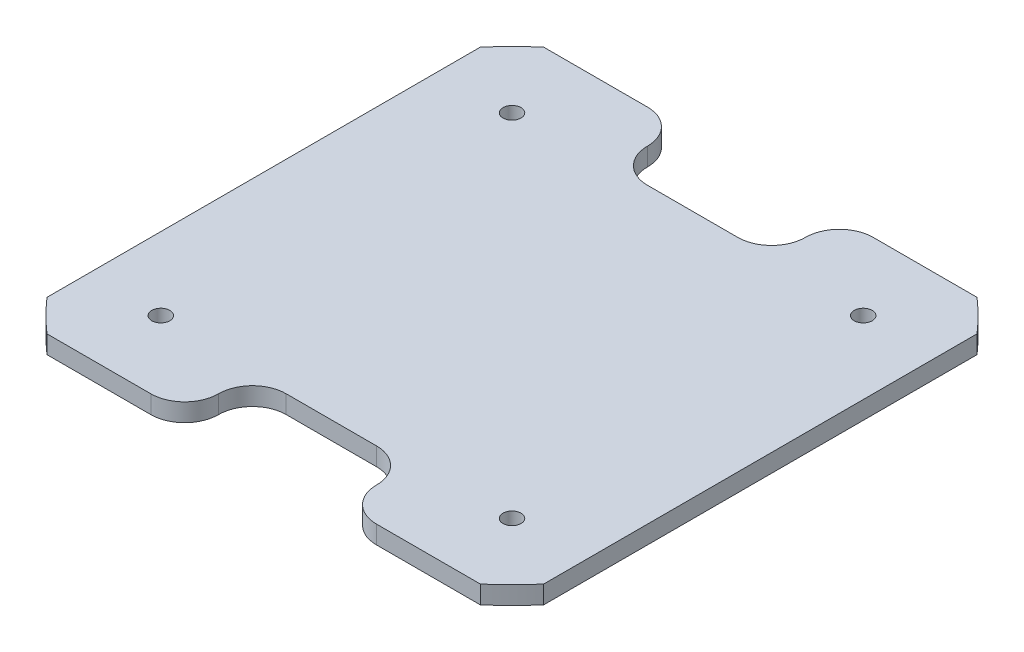
ISO-10303-21;
HEADER;
FILE_DESCRIPTION(('STEP AP214'),'2;1');
FILE_NAME('part.step','',(''),(''),'','','');
FILE_SCHEMA(('AUTOMOTIVE_DESIGN { 1 0 10303 214 1 1 1 1 }'));
ENDSEC;
DATA;
#1=APPLICATION_CONTEXT('core data for automotive mechanical design processes');
#2=APPLICATION_PROTOCOL_DEFINITION('international standard','automotive_design',2000,#1);
#3=PRODUCT_CONTEXT('',#1,'mechanical');
#4=PRODUCT('Part','Part','',(#3));
#5=PRODUCT_RELATED_PRODUCT_CATEGORY('part','',(#4));
#6=PRODUCT_DEFINITION_FORMATION('','',#4);
#7=PRODUCT_DEFINITION_CONTEXT('part definition',#1,'design');
#8=PRODUCT_DEFINITION('design','',#6,#7);
#9=PRODUCT_DEFINITION_SHAPE('','',#8);
#10=(LENGTH_UNIT() NAMED_UNIT(*) SI_UNIT(.MILLI.,.METRE.));
#11=(NAMED_UNIT(*) PLANE_ANGLE_UNIT() SI_UNIT($,.RADIAN.));
#12=(NAMED_UNIT(*) SI_UNIT($,.STERADIAN.) SOLID_ANGLE_UNIT());
#13=UNCERTAINTY_MEASURE_WITH_UNIT(LENGTH_MEASURE(1.E-05),#10,'distance_accuracy_value','');
#14=(GEOMETRIC_REPRESENTATION_CONTEXT(3) GLOBAL_UNCERTAINTY_ASSIGNED_CONTEXT((#13)) GLOBAL_UNIT_ASSIGNED_CONTEXT((#10,
#11,#12)) REPRESENTATION_CONTEXT('',''));
#15=CARTESIAN_POINT('',(0.,0.,0.));
#16=DIRECTION('',(0.,0.,1.));
#17=DIRECTION('',(1.,0.,0.));
#18=AXIS2_PLACEMENT_3D('',#15,#16,#17);
#19=CARTESIAN_POINT('',(0.,4.,0.));
#20=DIRECTION('',(0.,-1.,0.));
#21=DIRECTION('',(0.,0.,-1.));
#22=AXIS2_PLACEMENT_3D('',#19,#20,#21);
#23=CYLINDRICAL_SURFACE('',#22,73.);
#24=CARTESIAN_POINT('',(0.,0.,0.));
#25=DIRECTION('',(0.,1.,0.));
#26=DIRECTION('',(0.,0.,1.));
#27=AXIS2_PLACEMENT_3D('',#24,#25,#26);
#28=CIRCLE('',#27,73.);
#29=CARTESIAN_POINT('',(48.,0.,55.));
#30=VERTEX_POINT('',#29);
#31=CARTESIAN_POINT('',(55.,0.,48.));
#32=VERTEX_POINT('',#31);
#33=EDGE_CURVE('E206',#30,#32,#28,.T.);
#34=ORIENTED_EDGE('',*,*,#33,.T.);
#35=DIRECTION('',(0.,-1.,0.));
#36=VECTOR('',#35,1.);
#37=CARTESIAN_POINT('',(55.,4.,48.));
#38=LINE('',#37,#36);
#39=CARTESIAN_POINT('',(55.,4.,48.));
#40=VERTEX_POINT('',#39);
#41=EDGE_CURVE('E186',#40,#32,#38,.T.);
#42=ORIENTED_EDGE('',*,*,#41,.F.);
#43=CARTESIAN_POINT('',(0.,4.,0.));
#44=DIRECTION('',(0.,1.,0.));
#45=DIRECTION('',(0.,0.,1.));
#46=AXIS2_PLACEMENT_3D('',#43,#44,#45);
#47=CIRCLE('',#46,73.);
#48=CARTESIAN_POINT('',(48.,4.,55.));
#49=VERTEX_POINT('',#48);
#50=EDGE_CURVE('E193',#49,#40,#47,.T.);
#51=ORIENTED_EDGE('',*,*,#50,.F.);
#52=DIRECTION('',(0.,-1.,0.));
#53=VECTOR('',#52,1.);
#54=CARTESIAN_POINT('',(48.,4.,55.));
#55=LINE('',#54,#53);
#56=EDGE_CURVE('E334',#49,#30,#55,.T.);
#57=ORIENTED_EDGE('',*,*,#56,.T.);
#58=EDGE_LOOP('',(#34,#42,#51,#57));
#59=FACE_BOUND('',#58,.T.);
#60=ADVANCED_FACE('F44',(#59),#23,.T.);
#61=CARTESIAN_POINT('',(55.,4.,-48.));
#62=DIRECTION('',(-1.,0.,0.));
#63=DIRECTION('',(0.,0.,1.));
#64=AXIS2_PLACEMENT_3D('',#61,#62,#63);
#65=PLANE('',#64);
#66=DIRECTION('',(0.,0.,-1.));
#67=VECTOR('',#66,1.);
#68=CARTESIAN_POINT('',(55.,0.,-48.));
#69=LINE('',#68,#67);
#70=CARTESIAN_POINT('',(55.,0.,-48.));
#71=VERTEX_POINT('',#70);
#72=EDGE_CURVE('E375',#32,#71,#69,.T.);
#73=ORIENTED_EDGE('',*,*,#72,.T.);
#74=DIRECTION('',(0.,-1.,0.));
#75=VECTOR('',#74,1.);
#76=CARTESIAN_POINT('',(55.,4.,-48.));
#77=LINE('',#76,#75);
#78=CARTESIAN_POINT('',(55.,4.,-48.));
#79=VERTEX_POINT('',#78);
#80=EDGE_CURVE('E189',#79,#71,#77,.T.);
#81=ORIENTED_EDGE('',*,*,#80,.F.);
#82=DIRECTION('',(0.,0.,-1.));
#83=VECTOR('',#82,1.);
#84=CARTESIAN_POINT('',(55.,4.,-48.));
#85=LINE('',#84,#83);
#86=EDGE_CURVE('E182',#40,#79,#85,.T.);
#87=ORIENTED_EDGE('',*,*,#86,.F.);
#88=ORIENTED_EDGE('',*,*,#41,.T.);
#89=EDGE_LOOP('',(#73,#81,#87,#88));
#90=FACE_BOUND('',#89,.T.);
#91=ADVANCED_FACE('F184',(#90),#65,.F.);
#92=CARTESIAN_POINT('',(0.,4.,0.));
#93=DIRECTION('',(0.,-1.,0.));
#94=DIRECTION('',(0.,0.,-1.));
#95=AXIS2_PLACEMENT_3D('',#92,#93,#94);
#96=CYLINDRICAL_SURFACE('',#95,73.);
#97=CARTESIAN_POINT('',(0.,0.,0.));
#98=DIRECTION('',(0.,1.,0.));
#99=DIRECTION('',(0.,0.,1.));
#100=AXIS2_PLACEMENT_3D('',#97,#98,#99);
#101=CIRCLE('',#100,73.);
#102=CARTESIAN_POINT('',(48.,0.,-55.));
#103=VERTEX_POINT('',#102);
#104=EDGE_CURVE('E365',#71,#103,#101,.T.);
#105=ORIENTED_EDGE('',*,*,#104,.T.);
#106=DIRECTION('',(0.,-1.,0.));
#107=VECTOR('',#106,1.);
#108=CARTESIAN_POINT('',(48.,4.,-55.));
#109=LINE('',#108,#107);
#110=CARTESIAN_POINT('',(48.,4.,-55.));
#111=VERTEX_POINT('',#110);
#112=EDGE_CURVE('E216',#111,#103,#109,.T.);
#113=ORIENTED_EDGE('',*,*,#112,.F.);
#114=CARTESIAN_POINT('',(0.,4.,0.));
#115=DIRECTION('',(0.,1.,0.));
#116=DIRECTION('',(0.,0.,1.));
#117=AXIS2_PLACEMENT_3D('',#114,#115,#116);
#118=CIRCLE('',#117,73.);
#119=EDGE_CURVE('E192',#79,#111,#118,.T.);
#120=ORIENTED_EDGE('',*,*,#119,.F.);
#121=ORIENTED_EDGE('',*,*,#80,.T.);
#122=EDGE_LOOP('',(#105,#113,#120,#121));
#123=FACE_BOUND('',#122,.T.);
#124=ADVANCED_FACE('F420',(#123),#96,.T.);
#125=CARTESIAN_POINT('',(17.5,4.,-55.));
#126=DIRECTION('',(0.,0.,1.));
#127=DIRECTION('',(1.,0.,0.));
#128=AXIS2_PLACEMENT_3D('',#125,#126,#127);
#129=PLANE('',#128);
#130=DIRECTION('',(-1.,0.,0.));
#131=VECTOR('',#130,1.);
#132=CARTESIAN_POINT('',(17.5,0.,-55.));
#133=LINE('',#132,#131);
#134=CARTESIAN_POINT('',(25.,0.,-55.));
#135=VERTEX_POINT('',#134);
#136=EDGE_CURVE('E360',#103,#135,#133,.T.);
#137=ORIENTED_EDGE('',*,*,#136,.T.);
#138=DIRECTION('',(0.,-1.,0.));
#139=VECTOR('',#138,1.);
#140=CARTESIAN_POINT('',(25.,4.,-55.));
#141=LINE('',#140,#139);
#142=CARTESIAN_POINT('',(25.,4.,-55.));
#143=VERTEX_POINT('',#142);
#144=EDGE_CURVE('E228',#135,#143,#141,.F.);
#145=ORIENTED_EDGE('',*,*,#144,.T.);
#146=DIRECTION('',(-1.,0.,0.));
#147=VECTOR('',#146,1.);
#148=CARTESIAN_POINT('',(17.5,4.,-55.));
#149=LINE('',#148,#147);
#150=EDGE_CURVE('E362',#111,#143,#149,.T.);
#151=ORIENTED_EDGE('',*,*,#150,.F.);
#152=ORIENTED_EDGE('',*,*,#112,.T.);
#153=EDGE_LOOP('',(#137,#145,#151,#152));
#154=FACE_BOUND('',#153,.T.);
#155=ADVANCED_FACE('F359',(#154),#129,.F.);
#156=CARTESIAN_POINT('',(-17.5,4.,-40.));
#157=DIRECTION('',(0.,0.,1.));
#158=DIRECTION('',(1.,0.,0.));
#159=AXIS2_PLACEMENT_3D('',#156,#157,#158);
#160=PLANE('',#159);
#161=DIRECTION('',(-1.,0.,0.));
#162=VECTOR('',#161,1.);
#163=CARTESIAN_POINT('',(-17.5,4.,-40.));
#164=LINE('',#163,#162);
#165=CARTESIAN_POINT('',(10.,4.,-40.));
#166=VERTEX_POINT('',#165);
#167=CARTESIAN_POINT('',(-10.,4.,-40.));
#168=VERTEX_POINT('',#167);
#169=EDGE_CURVE('E423',#166,#168,#164,.T.);
#170=ORIENTED_EDGE('',*,*,#169,.F.);
#171=DIRECTION('',(0.,-1.,0.));
#172=VECTOR('',#171,1.);
#173=CARTESIAN_POINT('',(10.,0.,-40.));
#174=LINE('',#173,#172);
#175=CARTESIAN_POINT('',(10.,0.,-40.));
#176=VERTEX_POINT('',#175);
#177=EDGE_CURVE('E246',#166,#176,#174,.T.);
#178=ORIENTED_EDGE('',*,*,#177,.T.);
#179=DIRECTION('',(-1.,0.,0.));
#180=VECTOR('',#179,1.);
#181=CARTESIAN_POINT('',(-17.5,0.,-40.));
#182=LINE('',#181,#180);
#183=CARTESIAN_POINT('',(-10.,0.,-40.));
#184=VERTEX_POINT('',#183);
#185=EDGE_CURVE('E368',#176,#184,#182,.T.);
#186=ORIENTED_EDGE('',*,*,#185,.T.);
#187=DIRECTION('',(0.,-1.,0.));
#188=VECTOR('',#187,1.);
#189=CARTESIAN_POINT('',(-10.,4.,-40.));
#190=LINE('',#189,#188);
#191=EDGE_CURVE('E243',#184,#168,#190,.F.);
#192=ORIENTED_EDGE('',*,*,#191,.T.);
#193=EDGE_LOOP('',(#170,#178,#186,#192));
#194=FACE_BOUND('',#193,.T.);
#195=ADVANCED_FACE('F458',(#194),#160,.F.);
#196=CARTESIAN_POINT('',(-48.,4.,-55.));
#197=DIRECTION('',(0.,0.,1.));
#198=DIRECTION('',(1.,0.,0.));
#199=AXIS2_PLACEMENT_3D('',#196,#197,#198);
#200=PLANE('',#199);
#201=DIRECTION('',(-1.,0.,0.));
#202=VECTOR('',#201,1.);
#203=CARTESIAN_POINT('',(-48.,4.,-55.));
#204=LINE('',#203,#202);
#205=CARTESIAN_POINT('',(-25.,4.,-55.));
#206=VERTEX_POINT('',#205);
#207=CARTESIAN_POINT('',(-48.,4.,-55.));
#208=VERTEX_POINT('',#207);
#209=EDGE_CURVE('E429',#206,#208,#204,.T.);
#210=ORIENTED_EDGE('',*,*,#209,.F.);
#211=DIRECTION('',(0.,-1.,0.));
#212=VECTOR('',#211,1.);
#213=CARTESIAN_POINT('',(-25.,4.,-55.));
#214=LINE('',#213,#212);
#215=CARTESIAN_POINT('',(-25.,0.,-55.));
#216=VERTEX_POINT('',#215);
#217=EDGE_CURVE('E249',#206,#216,#214,.T.);
#218=ORIENTED_EDGE('',*,*,#217,.T.);
#219=DIRECTION('',(-1.,0.,0.));
#220=VECTOR('',#219,1.);
#221=CARTESIAN_POINT('',(-48.,0.,-55.));
#222=LINE('',#221,#220);
#223=CARTESIAN_POINT('',(-48.,0.,-55.));
#224=VERTEX_POINT('',#223);
#225=EDGE_CURVE('E372',#216,#224,#222,.T.);
#226=ORIENTED_EDGE('',*,*,#225,.T.);
#227=DIRECTION('',(0.,-1.,0.));
#228=VECTOR('',#227,1.);
#229=CARTESIAN_POINT('',(-48.,4.,-55.));
#230=LINE('',#229,#228);
#231=EDGE_CURVE('E348',#208,#224,#230,.T.);
#232=ORIENTED_EDGE('',*,*,#231,.F.);
#233=EDGE_LOOP('',(#210,#218,#226,#232));
#234=FACE_BOUND('',#233,.T.);
#235=ADVANCED_FACE('F445',(#234),#200,.F.);
#236=CARTESIAN_POINT('',(0.,4.,0.));
#237=DIRECTION('',(0.,-1.,0.));
#238=DIRECTION('',(0.,0.,-1.));
#239=AXIS2_PLACEMENT_3D('',#236,#237,#238);
#240=CYLINDRICAL_SURFACE('',#239,73.);
#241=CARTESIAN_POINT('',(0.,0.,0.));
#242=DIRECTION('',(0.,1.,0.));
#243=DIRECTION('',(0.,0.,1.));
#244=AXIS2_PLACEMENT_3D('',#241,#242,#243);
#245=CIRCLE('',#244,73.);
#246=CARTESIAN_POINT('',(-55.,0.,-48.));
#247=VERTEX_POINT('',#246);
#248=EDGE_CURVE('E381',#224,#247,#245,.T.);
#249=ORIENTED_EDGE('',*,*,#248,.T.);
#250=DIRECTION('',(0.,-1.,0.));
#251=VECTOR('',#250,1.);
#252=CARTESIAN_POINT('',(-55.,4.,-48.));
#253=LINE('',#252,#251);
#254=CARTESIAN_POINT('',(-55.,4.,-48.));
#255=VERTEX_POINT('',#254);
#256=EDGE_CURVE('E344',#255,#247,#253,.T.);
#257=ORIENTED_EDGE('',*,*,#256,.F.);
#258=CARTESIAN_POINT('',(0.,4.,0.));
#259=DIRECTION('',(0.,1.,0.));
#260=DIRECTION('',(0.,0.,1.));
#261=AXIS2_PLACEMENT_3D('',#258,#259,#260);
#262=CIRCLE('',#261,73.);
#263=EDGE_CURVE('E431',#208,#255,#262,.T.);
#264=ORIENTED_EDGE('',*,*,#263,.F.);
#265=ORIENTED_EDGE('',*,*,#231,.T.);
#266=EDGE_LOOP('',(#249,#257,#264,#265));
#267=FACE_BOUND('',#266,.T.);
#268=ADVANCED_FACE('F441',(#267),#240,.T.);
#269=CARTESIAN_POINT('',(-55.,4.,48.));
#270=DIRECTION('',(1.,0.,0.));
#271=DIRECTION('',(0.,0.,-1.));
#272=AXIS2_PLACEMENT_3D('',#269,#270,#271);
#273=PLANE('',#272);
#274=DIRECTION('',(0.,0.,1.));
#275=VECTOR('',#274,1.);
#276=CARTESIAN_POINT('',(-55.,0.,48.));
#277=LINE('',#276,#275);
#278=CARTESIAN_POINT('',(-55.,0.,48.));
#279=VERTEX_POINT('',#278);
#280=EDGE_CURVE('E384',#247,#279,#277,.T.);
#281=ORIENTED_EDGE('',*,*,#280,.T.);
#282=DIRECTION('',(0.,-1.,0.));
#283=VECTOR('',#282,1.);
#284=CARTESIAN_POINT('',(-55.,4.,48.));
#285=LINE('',#284,#283);
#286=CARTESIAN_POINT('',(-55.,4.,48.));
#287=VERTEX_POINT('',#286);
#288=EDGE_CURVE('E340',#287,#279,#285,.T.);
#289=ORIENTED_EDGE('',*,*,#288,.F.);
#290=DIRECTION('',(0.,0.,1.));
#291=VECTOR('',#290,1.);
#292=CARTESIAN_POINT('',(-55.,4.,48.));
#293=LINE('',#292,#291);
#294=EDGE_CURVE('E411',#255,#287,#293,.T.);
#295=ORIENTED_EDGE('',*,*,#294,.F.);
#296=ORIENTED_EDGE('',*,*,#256,.T.);
#297=EDGE_LOOP('',(#281,#289,#295,#296));
#298=FACE_BOUND('',#297,.T.);
#299=ADVANCED_FACE('F437',(#298),#273,.F.);
#300=CARTESIAN_POINT('',(0.,4.,0.));
#301=DIRECTION('',(0.,-1.,0.));
#302=DIRECTION('',(0.,0.,-1.));
#303=AXIS2_PLACEMENT_3D('',#300,#301,#302);
#304=CYLINDRICAL_SURFACE('',#303,73.);
#305=CARTESIAN_POINT('',(0.,0.,0.));
#306=DIRECTION('',(0.,1.,0.));
#307=DIRECTION('',(0.,0.,1.));
#308=AXIS2_PLACEMENT_3D('',#305,#306,#307);
#309=CIRCLE('',#308,73.);
#310=CARTESIAN_POINT('',(-48.,0.,55.));
#311=VERTEX_POINT('',#310);
#312=EDGE_CURVE('E330',#279,#311,#309,.T.);
#313=ORIENTED_EDGE('',*,*,#312,.T.);
#314=DIRECTION('',(0.,-1.,0.));
#315=VECTOR('',#314,1.);
#316=CARTESIAN_POINT('',(-48.,4.,55.));
#317=LINE('',#316,#315);
#318=CARTESIAN_POINT('',(-48.,4.,55.));
#319=VERTEX_POINT('',#318);
#320=EDGE_CURVE('E337',#319,#311,#317,.T.);
#321=ORIENTED_EDGE('',*,*,#320,.F.);
#322=CARTESIAN_POINT('',(0.,4.,0.));
#323=DIRECTION('',(0.,1.,0.));
#324=DIRECTION('',(0.,0.,1.));
#325=AXIS2_PLACEMENT_3D('',#322,#323,#324);
#326=CIRCLE('',#325,73.);
#327=EDGE_CURVE('E404',#287,#319,#326,.T.);
#328=ORIENTED_EDGE('',*,*,#327,.F.);
#329=ORIENTED_EDGE('',*,*,#288,.T.);
#330=EDGE_LOOP('',(#313,#321,#328,#329));
#331=FACE_BOUND('',#330,.T.);
#332=ADVANCED_FACE('F391',(#331),#304,.T.);
#333=CARTESIAN_POINT('',(-17.5,4.,55.));
#334=DIRECTION('',(0.,0.,-1.));
#335=DIRECTION('',(-1.,0.,0.));
#336=AXIS2_PLACEMENT_3D('',#333,#334,#335);
#337=PLANE('',#336);
#338=DIRECTION('',(1.,0.,0.));
#339=VECTOR('',#338,1.);
#340=CARTESIAN_POINT('',(-17.5,0.,55.));
#341=LINE('',#340,#339);
#342=CARTESIAN_POINT('',(-25.,0.,55.));
#343=VERTEX_POINT('',#342);
#344=EDGE_CURVE('E323',#311,#343,#341,.T.);
#345=ORIENTED_EDGE('',*,*,#344,.T.);
#346=DIRECTION('',(0.,-1.,0.));
#347=VECTOR('',#346,1.);
#348=CARTESIAN_POINT('',(-25.,4.,55.));
#349=LINE('',#348,#347);
#350=CARTESIAN_POINT('',(-25.,4.,55.));
#351=VERTEX_POINT('',#350);
#352=EDGE_CURVE('E253',#343,#351,#349,.F.);
#353=ORIENTED_EDGE('',*,*,#352,.T.);
#354=DIRECTION('',(1.,0.,0.));
#355=VECTOR('',#354,1.);
#356=CARTESIAN_POINT('',(-17.5,4.,55.));
#357=LINE('',#356,#355);
#358=EDGE_CURVE('E401',#319,#351,#357,.T.);
#359=ORIENTED_EDGE('',*,*,#358,.F.);
#360=ORIENTED_EDGE('',*,*,#320,.T.);
#361=EDGE_LOOP('',(#345,#353,#359,#360));
#362=FACE_BOUND('',#361,.T.);
#363=ADVANCED_FACE('F398',(#362),#337,.F.);
#364=CARTESIAN_POINT('',(-17.5,4.,40.));
#365=DIRECTION('',(0.,0.,-1.));
#366=DIRECTION('',(-1.,0.,0.));
#367=AXIS2_PLACEMENT_3D('',#364,#365,#366);
#368=PLANE('',#367);
#369=DIRECTION('',(1.,0.,0.));
#370=VECTOR('',#369,1.);
#371=CARTESIAN_POINT('',(-17.5,4.,40.));
#372=LINE('',#371,#370);
#373=CARTESIAN_POINT('',(-10.,4.,40.));
#374=VERTEX_POINT('',#373);
#375=CARTESIAN_POINT('',(10.,4.,40.));
#376=VERTEX_POINT('',#375);
#377=EDGE_CURVE('E406',#374,#376,#372,.T.);
#378=ORIENTED_EDGE('',*,*,#377,.F.);
#379=DIRECTION('',(0.,-1.,0.));
#380=VECTOR('',#379,1.);
#381=CARTESIAN_POINT('',(-10.,0.,40.));
#382=LINE('',#381,#380);
#383=CARTESIAN_POINT('',(-10.,0.,40.));
#384=VERTEX_POINT('',#383);
#385=EDGE_CURVE('E260',#374,#384,#382,.T.);
#386=ORIENTED_EDGE('',*,*,#385,.T.);
#387=DIRECTION('',(1.,0.,0.));
#388=VECTOR('',#387,1.);
#389=CARTESIAN_POINT('',(-17.5,0.,40.));
#390=LINE('',#389,#388);
#391=CARTESIAN_POINT('',(10.,0.,40.));
#392=VERTEX_POINT('',#391);
#393=EDGE_CURVE('E315',#384,#392,#390,.T.);
#394=ORIENTED_EDGE('',*,*,#393,.T.);
#395=DIRECTION('',(0.,-1.,0.));
#396=VECTOR('',#395,1.);
#397=CARTESIAN_POINT('',(10.,4.,40.));
#398=LINE('',#397,#396);
#399=EDGE_CURVE('E257',#392,#376,#398,.F.);
#400=ORIENTED_EDGE('',*,*,#399,.T.);
#401=EDGE_LOOP('',(#378,#386,#394,#400));
#402=FACE_BOUND('',#401,.T.);
#403=ADVANCED_FACE('F320',(#402),#368,.F.);
#404=CARTESIAN_POINT('',(48.,4.,55.));
#405=DIRECTION('',(0.,0.,-1.));
#406=DIRECTION('',(-1.,0.,0.));
#407=AXIS2_PLACEMENT_3D('',#404,#405,#406);
#408=PLANE('',#407);
#409=DIRECTION('',(1.,0.,0.));
#410=VECTOR('',#409,1.);
#411=CARTESIAN_POINT('',(48.,4.,55.));
#412=LINE('',#411,#410);
#413=CARTESIAN_POINT('',(25.,4.,55.));
#414=VERTEX_POINT('',#413);
#415=EDGE_CURVE('E198',#414,#49,#412,.T.);
#416=ORIENTED_EDGE('',*,*,#415,.F.);
#417=DIRECTION('',(0.,-1.,0.));
#418=VECTOR('',#417,1.);
#419=CARTESIAN_POINT('',(25.,4.,55.));
#420=LINE('',#419,#418);
#421=CARTESIAN_POINT('',(25.,0.,55.));
#422=VERTEX_POINT('',#421);
#423=EDGE_CURVE('E263',#414,#422,#420,.T.);
#424=ORIENTED_EDGE('',*,*,#423,.T.);
#425=DIRECTION('',(1.,0.,0.));
#426=VECTOR('',#425,1.);
#427=CARTESIAN_POINT('',(48.,0.,55.));
#428=LINE('',#427,#426);
#429=EDGE_CURVE('E203',#422,#30,#428,.T.);
#430=ORIENTED_EDGE('',*,*,#429,.T.);
#431=ORIENTED_EDGE('',*,*,#56,.F.);
#432=EDGE_LOOP('',(#416,#424,#430,#431));
#433=FACE_BOUND('',#432,.T.);
#434=ADVANCED_FACE('F501',(#433),#408,.F.);
#435=CARTESIAN_POINT('',(0.,4.,0.));
#436=DIRECTION('',(0.,1.,0.));
#437=DIRECTION('',(0.,0.,1.));
#438=AXIS2_PLACEMENT_3D('',#435,#436,#437);
#439=PLANE('',#438);
#440=CARTESIAN_POINT('',(38.8908729652599,4.,-38.8908729652603));
#441=DIRECTION('',(0.,1.,0.));
#442=DIRECTION('',(0.,0.,1.));
#443=AXIS2_PLACEMENT_3D('',#440,#441,#442);
#444=CIRCLE('',#443,1.99999999999999);
#445=CARTESIAN_POINT('',(38.8908729652599,4.,-36.8908729652603));
#446=VERTEX_POINT('',#445);
#447=EDGE_CURVE('E291',#446,#446,#444,.T.);
#448=ORIENTED_EDGE('',*,*,#447,.F.);
#449=EDGE_LOOP('',(#448));
#450=FACE_BOUND('',#449,.T.);
#451=CARTESIAN_POINT('',(38.8908729652603,4.,38.8908729652599));
#452=DIRECTION('',(0.,1.,0.));
#453=DIRECTION('',(0.,0.,1.));
#454=AXIS2_PLACEMENT_3D('',#451,#452,#453);
#455=CIRCLE('',#454,1.99999999999999);
#456=CARTESIAN_POINT('',(38.8908729652603,4.,40.8908729652599));
#457=VERTEX_POINT('',#456);
#458=EDGE_CURVE('E536',#457,#457,#455,.T.);
#459=ORIENTED_EDGE('',*,*,#458,.F.);
#460=EDGE_LOOP('',(#459));
#461=FACE_BOUND('',#460,.T.);
#462=CARTESIAN_POINT('',(-38.8908729652599,4.,38.8908729652603));
#463=DIRECTION('',(0.,1.,0.));
#464=DIRECTION('',(0.,0.,1.));
#465=AXIS2_PLACEMENT_3D('',#462,#463,#464);
#466=CIRCLE('',#465,1.99999999999999);
#467=CARTESIAN_POINT('',(-38.8908729652599,4.,40.8908729652603));
#468=VERTEX_POINT('',#467);
#469=EDGE_CURVE('E546',#468,#468,#466,.T.);
#470=ORIENTED_EDGE('',*,*,#469,.F.);
#471=EDGE_LOOP('',(#470));
#472=FACE_BOUND('',#471,.T.);
#473=CARTESIAN_POINT('',(-38.8908729652603,4.,-38.8908729652599));
#474=DIRECTION('',(0.,1.,0.));
#475=DIRECTION('',(0.,0.,1.));
#476=AXIS2_PLACEMENT_3D('',#473,#474,#475);
#477=CIRCLE('',#476,1.99999999999999);
#478=CARTESIAN_POINT('',(-38.8908729652603,4.,-36.8908729652599));
#479=VERTEX_POINT('',#478);
#480=EDGE_CURVE('E553',#479,#479,#477,.T.);
#481=ORIENTED_EDGE('',*,*,#480,.F.);
#482=EDGE_LOOP('',(#481));
#483=FACE_BOUND('',#482,.T.);
#484=ORIENTED_EDGE('',*,*,#150,.T.);
#485=CARTESIAN_POINT('',(25.,4.,-47.5));
#486=DIRECTION('',(0.,1.,0.));
#487=DIRECTION('',(0.,0.,1.));
#488=AXIS2_PLACEMENT_3D('',#485,#486,#487);
#489=CIRCLE('',#488,7.5);
#490=CARTESIAN_POINT('',(17.5,4.,-47.5));
#491=VERTEX_POINT('',#490);
#492=EDGE_CURVE('E240',#143,#491,#489,.T.);
#493=ORIENTED_EDGE('',*,*,#492,.T.);
#494=CARTESIAN_POINT('',(10.,4.,-47.5));
#495=DIRECTION('',(0.,1.,0.));
#496=DIRECTION('',(0.,0.,1.));
#497=AXIS2_PLACEMENT_3D('',#494,#495,#496);
#498=CIRCLE('',#497,7.5);
#499=EDGE_CURVE('E270',#491,#166,#498,.F.);
#500=ORIENTED_EDGE('',*,*,#499,.T.);
#501=ORIENTED_EDGE('',*,*,#169,.T.);
#502=CARTESIAN_POINT('',(-10.,4.,-47.5));
#503=DIRECTION('',(0.,1.,0.));
#504=DIRECTION('',(0.,0.,1.));
#505=AXIS2_PLACEMENT_3D('',#502,#503,#504);
#506=CIRCLE('',#505,7.5);
#507=CARTESIAN_POINT('',(-17.5,4.,-47.5));
#508=VERTEX_POINT('',#507);
#509=EDGE_CURVE('E276',#168,#508,#506,.F.);
#510=ORIENTED_EDGE('',*,*,#509,.T.);
#511=CARTESIAN_POINT('',(-25.,4.,-47.5));
#512=DIRECTION('',(0.,1.,0.));
#513=DIRECTION('',(0.,0.,1.));
#514=AXIS2_PLACEMENT_3D('',#511,#512,#513);
#515=CIRCLE('',#514,7.5);
#516=EDGE_CURVE('E237',#508,#206,#515,.T.);
#517=ORIENTED_EDGE('',*,*,#516,.T.);
#518=ORIENTED_EDGE('',*,*,#209,.T.);
#519=ORIENTED_EDGE('',*,*,#263,.T.);
#520=ORIENTED_EDGE('',*,*,#294,.T.);
#521=ORIENTED_EDGE('',*,*,#327,.T.);
#522=ORIENTED_EDGE('',*,*,#358,.T.);
#523=CARTESIAN_POINT('',(-25.,4.,47.5));
#524=DIRECTION('',(0.,1.,0.));
#525=DIRECTION('',(0.,0.,1.));
#526=AXIS2_PLACEMENT_3D('',#523,#524,#525);
#527=CIRCLE('',#526,7.5);
#528=CARTESIAN_POINT('',(-17.5,4.,47.5));
#529=VERTEX_POINT('',#528);
#530=EDGE_CURVE('E234',#351,#529,#527,.T.);
#531=ORIENTED_EDGE('',*,*,#530,.T.);
#532=CARTESIAN_POINT('',(-10.,4.,47.5));
#533=DIRECTION('',(0.,1.,0.));
#534=DIRECTION('',(0.,0.,1.));
#535=AXIS2_PLACEMENT_3D('',#532,#533,#534);
#536=CIRCLE('',#535,7.5);
#537=EDGE_CURVE('E282',#529,#374,#536,.F.);
#538=ORIENTED_EDGE('',*,*,#537,.T.);
#539=ORIENTED_EDGE('',*,*,#377,.T.);
#540=CARTESIAN_POINT('',(10.,4.,47.5));
#541=DIRECTION('',(0.,1.,0.));
#542=DIRECTION('',(0.,0.,1.));
#543=AXIS2_PLACEMENT_3D('',#540,#541,#542);
#544=CIRCLE('',#543,7.5);
#545=CARTESIAN_POINT('',(17.5,4.,47.5));
#546=VERTEX_POINT('',#545);
#547=EDGE_CURVE('E11',#376,#546,#544,.F.);
#548=ORIENTED_EDGE('',*,*,#547,.T.);
#549=CARTESIAN_POINT('',(25.,4.,47.5));
#550=DIRECTION('',(0.,1.,0.));
#551=DIRECTION('',(0.,0.,1.));
#552=AXIS2_PLACEMENT_3D('',#549,#550,#551);
#553=CIRCLE('',#552,7.5);
#554=EDGE_CURVE('E61',#546,#414,#553,.T.);
#555=ORIENTED_EDGE('',*,*,#554,.T.);
#556=ORIENTED_EDGE('',*,*,#415,.T.);
#557=ORIENTED_EDGE('',*,*,#50,.T.);
#558=ORIENTED_EDGE('',*,*,#86,.T.);
#559=ORIENTED_EDGE('',*,*,#119,.T.);
#560=EDGE_LOOP('',(#484,#493,#500,#501,#510,#517,#518,#519,#520,#521,#522,#531,#538,#539,#548,
#555,#556,#557,#558,#559));
#561=FACE_BOUND('',#560,.T.);
#562=ADVANCED_FACE('F197',(#450,#461,#472,#483,#561),#439,.T.);
#563=CARTESIAN_POINT('',(0.,0.,0.));
#564=DIRECTION('',(0.,1.,0.));
#565=DIRECTION('',(0.,0.,1.));
#566=AXIS2_PLACEMENT_3D('',#563,#564,#565);
#567=PLANE('',#566);
#568=CARTESIAN_POINT('',(38.8908729652599,0.,-38.8908729652603));
#569=DIRECTION('',(0.,1.,0.));
#570=DIRECTION('',(0.,0.,1.));
#571=AXIS2_PLACEMENT_3D('',#568,#569,#570);
#572=CIRCLE('',#571,2.);
#573=CARTESIAN_POINT('',(38.8908729652599,0.,-36.8908729652603));
#574=VERTEX_POINT('',#573);
#575=EDGE_CURVE('E530',#574,#574,#572,.T.);
#576=ORIENTED_EDGE('',*,*,#575,.T.);
#577=EDGE_LOOP('',(#576));
#578=FACE_BOUND('',#577,.T.);
#579=CARTESIAN_POINT('',(38.8908729652603,0.,38.8908729652599));
#580=DIRECTION('',(0.,1.,0.));
#581=DIRECTION('',(0.,0.,1.));
#582=AXIS2_PLACEMENT_3D('',#579,#580,#581);
#583=CIRCLE('',#582,2.);
#584=CARTESIAN_POINT('',(38.8908729652603,0.,40.8908729652599));
#585=VERTEX_POINT('',#584);
#586=EDGE_CURVE('E542',#585,#585,#583,.T.);
#587=ORIENTED_EDGE('',*,*,#586,.T.);
#588=EDGE_LOOP('',(#587));
#589=FACE_BOUND('',#588,.T.);
#590=CARTESIAN_POINT('',(-38.8908729652599,0.,38.8908729652603));
#591=DIRECTION('',(0.,1.,0.));
#592=DIRECTION('',(0.,0.,1.));
#593=AXIS2_PLACEMENT_3D('',#590,#591,#592);
#594=CIRCLE('',#593,2.);
#595=CARTESIAN_POINT('',(-38.8908729652599,0.,40.8908729652603));
#596=VERTEX_POINT('',#595);
#597=EDGE_CURVE('E549',#596,#596,#594,.T.);
#598=ORIENTED_EDGE('',*,*,#597,.T.);
#599=EDGE_LOOP('',(#598));
#600=FACE_BOUND('',#599,.T.);
#601=CARTESIAN_POINT('',(-38.8908729652603,0.,-38.8908729652599));
#602=DIRECTION('',(0.,1.,0.));
#603=DIRECTION('',(0.,0.,1.));
#604=AXIS2_PLACEMENT_3D('',#601,#602,#603);
#605=CIRCLE('',#604,2.);
#606=CARTESIAN_POINT('',(-38.8908729652603,0.,-36.8908729652599));
#607=VERTEX_POINT('',#606);
#608=EDGE_CURVE('E417',#607,#607,#605,.T.);
#609=ORIENTED_EDGE('',*,*,#608,.T.);
#610=EDGE_LOOP('',(#609));
#611=FACE_BOUND('',#610,.T.);
#612=ORIENTED_EDGE('',*,*,#185,.F.);
#613=CARTESIAN_POINT('',(10.,0.,-47.5));
#614=DIRECTION('',(0.,1.,0.));
#615=DIRECTION('',(0.,0.,1.));
#616=AXIS2_PLACEMENT_3D('',#613,#614,#615);
#617=CIRCLE('',#616,7.5);
#618=CARTESIAN_POINT('',(17.5,0.,-47.5));
#619=VERTEX_POINT('',#618);
#620=EDGE_CURVE('E267',#176,#619,#617,.T.);
#621=ORIENTED_EDGE('',*,*,#620,.T.);
#622=CARTESIAN_POINT('',(25.,0.,-47.5));
#623=DIRECTION('',(0.,1.,0.));
#624=DIRECTION('',(0.,0.,1.));
#625=AXIS2_PLACEMENT_3D('',#622,#623,#624);
#626=CIRCLE('',#625,7.5);
#627=EDGE_CURVE('E225',#619,#135,#626,.F.);
#628=ORIENTED_EDGE('',*,*,#627,.T.);
#629=ORIENTED_EDGE('',*,*,#136,.F.);
#630=ORIENTED_EDGE('',*,*,#104,.F.);
#631=ORIENTED_EDGE('',*,*,#72,.F.);
#632=ORIENTED_EDGE('',*,*,#33,.F.);
#633=ORIENTED_EDGE('',*,*,#429,.F.);
#634=CARTESIAN_POINT('',(25.,0.,47.5));
#635=DIRECTION('',(0.,1.,0.));
#636=DIRECTION('',(0.,0.,1.));
#637=AXIS2_PLACEMENT_3D('',#634,#635,#636);
#638=CIRCLE('',#637,7.5);
#639=CARTESIAN_POINT('',(17.5,0.,47.5));
#640=VERTEX_POINT('',#639);
#641=EDGE_CURVE('E208',#422,#640,#638,.F.);
#642=ORIENTED_EDGE('',*,*,#641,.T.);
#643=CARTESIAN_POINT('',(10.,0.,47.5));
#644=DIRECTION('',(0.,1.,0.));
#645=DIRECTION('',(0.,0.,1.));
#646=AXIS2_PLACEMENT_3D('',#643,#644,#645);
#647=CIRCLE('',#646,7.5);
#648=EDGE_CURVE('E54',#640,#392,#647,.T.);
#649=ORIENTED_EDGE('',*,*,#648,.T.);
#650=ORIENTED_EDGE('',*,*,#393,.F.);
#651=CARTESIAN_POINT('',(-10.,0.,47.5));
#652=DIRECTION('',(0.,1.,0.));
#653=DIRECTION('',(0.,0.,1.));
#654=AXIS2_PLACEMENT_3D('',#651,#652,#653);
#655=CIRCLE('',#654,7.5);
#656=CARTESIAN_POINT('',(-17.5,0.,47.5));
#657=VERTEX_POINT('',#656);
#658=EDGE_CURVE('E279',#384,#657,#655,.T.);
#659=ORIENTED_EDGE('',*,*,#658,.T.);
#660=CARTESIAN_POINT('',(-25.,0.,47.5));
#661=DIRECTION('',(0.,1.,0.));
#662=DIRECTION('',(0.,0.,1.));
#663=AXIS2_PLACEMENT_3D('',#660,#661,#662);
#664=CIRCLE('',#663,7.5);
#665=EDGE_CURVE('E213',#657,#343,#664,.F.);
#666=ORIENTED_EDGE('',*,*,#665,.T.);
#667=ORIENTED_EDGE('',*,*,#344,.F.);
#668=ORIENTED_EDGE('',*,*,#312,.F.);
#669=ORIENTED_EDGE('',*,*,#280,.F.);
#670=ORIENTED_EDGE('',*,*,#248,.F.);
#671=ORIENTED_EDGE('',*,*,#225,.F.);
#672=CARTESIAN_POINT('',(-25.,0.,-47.5));
#673=DIRECTION('',(0.,1.,0.));
#674=DIRECTION('',(0.,0.,1.));
#675=AXIS2_PLACEMENT_3D('',#672,#673,#674);
#676=CIRCLE('',#675,7.5);
#677=CARTESIAN_POINT('',(-17.5,0.,-47.5));
#678=VERTEX_POINT('',#677);
#679=EDGE_CURVE('E222',#216,#678,#676,.F.);
#680=ORIENTED_EDGE('',*,*,#679,.T.);
#681=CARTESIAN_POINT('',(-10.,0.,-47.5));
#682=DIRECTION('',(0.,1.,0.));
#683=DIRECTION('',(0.,0.,1.));
#684=AXIS2_PLACEMENT_3D('',#681,#682,#683);
#685=CIRCLE('',#684,7.5);
#686=EDGE_CURVE('E273',#678,#184,#685,.T.);
#687=ORIENTED_EDGE('',*,*,#686,.T.);
#688=EDGE_LOOP('',(#612,#621,#628,#629,#630,#631,#632,#633,#642,#649,#650,#659,#666,#667,#668,
#669,#670,#671,#680,#687));
#689=FACE_BOUND('',#688,.T.);
#690=ADVANCED_FACE('F314',(#578,#589,#600,#611,#689),#567,.F.);
#691=CARTESIAN_POINT('',(-38.8908729652603,4.,-38.8908729652599));
#692=DIRECTION('',(0.,1.,0.));
#693=DIRECTION('',(0.,0.,1.));
#694=AXIS2_PLACEMENT_3D('',#691,#692,#693);
#695=CYLINDRICAL_SURFACE('',#694,1.99999999999999);
#696=ORIENTED_EDGE('',*,*,#608,.F.);
#697=EDGE_LOOP('',(#696));
#698=FACE_BOUND('',#697,.T.);
#699=ORIENTED_EDGE('',*,*,#480,.T.);
#700=EDGE_LOOP('',(#699));
#701=FACE_BOUND('',#700,.T.);
#702=ADVANCED_FACE('F507',(#698,#701),#695,.F.);
#703=CARTESIAN_POINT('',(-38.8908729652599,4.,38.8908729652603));
#704=DIRECTION('',(0.,1.,0.));
#705=DIRECTION('',(0.,0.,1.));
#706=AXIS2_PLACEMENT_3D('',#703,#704,#705);
#707=CYLINDRICAL_SURFACE('',#706,1.99999999999999);
#708=ORIENTED_EDGE('',*,*,#597,.F.);
#709=EDGE_LOOP('',(#708));
#710=FACE_BOUND('',#709,.T.);
#711=ORIENTED_EDGE('',*,*,#469,.T.);
#712=EDGE_LOOP('',(#711));
#713=FACE_BOUND('',#712,.T.);
#714=ADVANCED_FACE('F514',(#710,#713),#707,.F.);
#715=CARTESIAN_POINT('',(38.8908729652603,4.,38.8908729652599));
#716=DIRECTION('',(0.,1.,0.));
#717=DIRECTION('',(0.,0.,1.));
#718=AXIS2_PLACEMENT_3D('',#715,#716,#717);
#719=CYLINDRICAL_SURFACE('',#718,1.99999999999999);
#720=ORIENTED_EDGE('',*,*,#586,.F.);
#721=EDGE_LOOP('',(#720));
#722=FACE_BOUND('',#721,.T.);
#723=ORIENTED_EDGE('',*,*,#458,.T.);
#724=EDGE_LOOP('',(#723));
#725=FACE_BOUND('',#724,.T.);
#726=ADVANCED_FACE('F518',(#722,#725),#719,.F.);
#727=CARTESIAN_POINT('',(38.8908729652599,4.,-38.8908729652603));
#728=DIRECTION('',(0.,1.,0.));
#729=DIRECTION('',(0.,0.,1.));
#730=AXIS2_PLACEMENT_3D('',#727,#728,#729);
#731=CYLINDRICAL_SURFACE('',#730,1.99999999999999);
#732=ORIENTED_EDGE('',*,*,#575,.F.);
#733=EDGE_LOOP('',(#732));
#734=FACE_BOUND('',#733,.T.);
#735=ORIENTED_EDGE('',*,*,#447,.T.);
#736=EDGE_LOOP('',(#735));
#737=FACE_BOUND('',#736,.T.);
#738=ADVANCED_FACE('F474',(#734,#737),#731,.F.);
#739=CARTESIAN_POINT('',(10.,4.,-47.5));
#740=DIRECTION('',(0.,1.,0.));
#741=DIRECTION('',(0.,0.,1.));
#742=AXIS2_PLACEMENT_3D('',#739,#740,#741);
#743=CYLINDRICAL_SURFACE('',#742,7.5);
#744=ORIENTED_EDGE('',*,*,#177,.F.);
#745=ORIENTED_EDGE('',*,*,#499,.F.);
#746=DIRECTION('',(0.,-1.,0.));
#747=VECTOR('',#746,1.);
#748=CARTESIAN_POINT('',(17.5,4.,-47.5));
#749=LINE('',#748,#747);
#750=EDGE_CURVE('E287',#619,#491,#749,.F.);
#751=ORIENTED_EDGE('',*,*,#750,.F.);
#752=ORIENTED_EDGE('',*,*,#620,.F.);
#753=EDGE_LOOP('',(#744,#745,#751,#752));
#754=FACE_BOUND('',#753,.T.);
#755=ADVANCED_FACE('F463',(#754),#743,.F.);
#756=CARTESIAN_POINT('',(25.,4.,-47.5));
#757=DIRECTION('',(0.,-1.,0.));
#758=DIRECTION('',(0.,0.,-1.));
#759=AXIS2_PLACEMENT_3D('',#756,#757,#758);
#760=CYLINDRICAL_SURFACE('',#759,7.5);
#761=ORIENTED_EDGE('',*,*,#492,.F.);
#762=ORIENTED_EDGE('',*,*,#144,.F.);
#763=ORIENTED_EDGE('',*,*,#627,.F.);
#764=ORIENTED_EDGE('',*,*,#750,.T.);
#765=EDGE_LOOP('',(#761,#762,#763,#764));
#766=FACE_BOUND('',#765,.T.);
#767=ADVANCED_FACE('F466',(#766),#760,.T.);
#768=CARTESIAN_POINT('',(-10.,4.,-47.5));
#769=DIRECTION('',(0.,1.,0.));
#770=DIRECTION('',(0.,0.,1.));
#771=AXIS2_PLACEMENT_3D('',#768,#769,#770);
#772=CYLINDRICAL_SURFACE('',#771,7.5);
#773=DIRECTION('',(0.,-1.,0.));
#774=VECTOR('',#773,1.);
#775=CARTESIAN_POINT('',(-17.5,0.,-47.5));
#776=LINE('',#775,#774);
#777=EDGE_CURVE('E292',#508,#678,#776,.T.);
#778=ORIENTED_EDGE('',*,*,#777,.F.);
#779=ORIENTED_EDGE('',*,*,#509,.F.);
#780=ORIENTED_EDGE('',*,*,#191,.F.);
#781=ORIENTED_EDGE('',*,*,#686,.F.);
#782=EDGE_LOOP('',(#778,#779,#780,#781));
#783=FACE_BOUND('',#782,.T.);
#784=ADVANCED_FACE('F454',(#783),#772,.F.);
#785=CARTESIAN_POINT('',(-25.,4.,-47.5));
#786=DIRECTION('',(0.,-1.,0.));
#787=DIRECTION('',(0.,0.,-1.));
#788=AXIS2_PLACEMENT_3D('',#785,#786,#787);
#789=CYLINDRICAL_SURFACE('',#788,7.5);
#790=ORIENTED_EDGE('',*,*,#516,.F.);
#791=ORIENTED_EDGE('',*,*,#777,.T.);
#792=ORIENTED_EDGE('',*,*,#679,.F.);
#793=ORIENTED_EDGE('',*,*,#217,.F.);
#794=EDGE_LOOP('',(#790,#791,#792,#793));
#795=FACE_BOUND('',#794,.T.);
#796=ADVANCED_FACE('F449',(#795),#789,.T.);
#797=CARTESIAN_POINT('',(-10.,4.,47.5));
#798=DIRECTION('',(0.,1.,0.));
#799=DIRECTION('',(0.,0.,1.));
#800=AXIS2_PLACEMENT_3D('',#797,#798,#799);
#801=CYLINDRICAL_SURFACE('',#800,7.5);
#802=ORIENTED_EDGE('',*,*,#385,.F.);
#803=ORIENTED_EDGE('',*,*,#537,.F.);
#804=DIRECTION('',(0.,-1.,0.));
#805=VECTOR('',#804,1.);
#806=CARTESIAN_POINT('',(-17.5,4.,47.5));
#807=LINE('',#806,#805);
#808=EDGE_CURVE('E295',#657,#529,#807,.F.);
#809=ORIENTED_EDGE('',*,*,#808,.F.);
#810=ORIENTED_EDGE('',*,*,#658,.F.);
#811=EDGE_LOOP('',(#802,#803,#809,#810));
#812=FACE_BOUND('',#811,.T.);
#813=ADVANCED_FACE('F594',(#812),#801,.F.);
#814=CARTESIAN_POINT('',(-25.,4.,47.5));
#815=DIRECTION('',(0.,-1.,0.));
#816=DIRECTION('',(0.,0.,-1.));
#817=AXIS2_PLACEMENT_3D('',#814,#815,#816);
#818=CYLINDRICAL_SURFACE('',#817,7.5);
#819=ORIENTED_EDGE('',*,*,#530,.F.);
#820=ORIENTED_EDGE('',*,*,#352,.F.);
#821=ORIENTED_EDGE('',*,*,#665,.F.);
#822=ORIENTED_EDGE('',*,*,#808,.T.);
#823=EDGE_LOOP('',(#819,#820,#821,#822));
#824=FACE_BOUND('',#823,.T.);
#825=ADVANCED_FACE('F402',(#824),#818,.T.);
#826=CARTESIAN_POINT('',(10.,4.,47.5));
#827=DIRECTION('',(0.,1.,0.));
#828=DIRECTION('',(0.,0.,1.));
#829=AXIS2_PLACEMENT_3D('',#826,#827,#828);
#830=CYLINDRICAL_SURFACE('',#829,7.5);
#831=DIRECTION('',(0.,-1.,0.));
#832=VECTOR('',#831,1.);
#833=CARTESIAN_POINT('',(17.5,0.,47.5));
#834=LINE('',#833,#832);
#835=EDGE_CURVE('E48',#546,#640,#834,.T.);
#836=ORIENTED_EDGE('',*,*,#835,.F.);
#837=ORIENTED_EDGE('',*,*,#547,.F.);
#838=ORIENTED_EDGE('',*,*,#399,.F.);
#839=ORIENTED_EDGE('',*,*,#648,.F.);
#840=EDGE_LOOP('',(#836,#837,#838,#839));
#841=FACE_BOUND('',#840,.T.);
#842=ADVANCED_FACE('F46',(#841),#830,.F.);
#843=CARTESIAN_POINT('',(25.,4.,47.5));
#844=DIRECTION('',(0.,-1.,0.));
#845=DIRECTION('',(0.,0.,-1.));
#846=AXIS2_PLACEMENT_3D('',#843,#844,#845);
#847=CYLINDRICAL_SURFACE('',#846,7.5);
#848=ORIENTED_EDGE('',*,*,#554,.F.);
#849=ORIENTED_EDGE('',*,*,#835,.T.);
#850=ORIENTED_EDGE('',*,*,#641,.F.);
#851=ORIENTED_EDGE('',*,*,#423,.F.);
#852=EDGE_LOOP('',(#848,#849,#850,#851));
#853=FACE_BOUND('',#852,.T.);
#854=ADVANCED_FACE('F305',(#853),#847,.T.);
#855=CLOSED_SHELL('',(#60,#91,#124,#155,#195,#235,#268,#299,#332,#363,#403,#434,#562,#690,#702,
#714,#726,#738,#755,#767,#784,#796,#813,#825,#842,#854));
#856=MANIFOLD_SOLID_BREP('B2',#855);
#857=ADVANCED_BREP_SHAPE_REPRESENTATION('',(#18,#856),#14);
#858=SHAPE_DEFINITION_REPRESENTATION(#9,#857);
ENDSEC;
END-ISO-10303-21;
